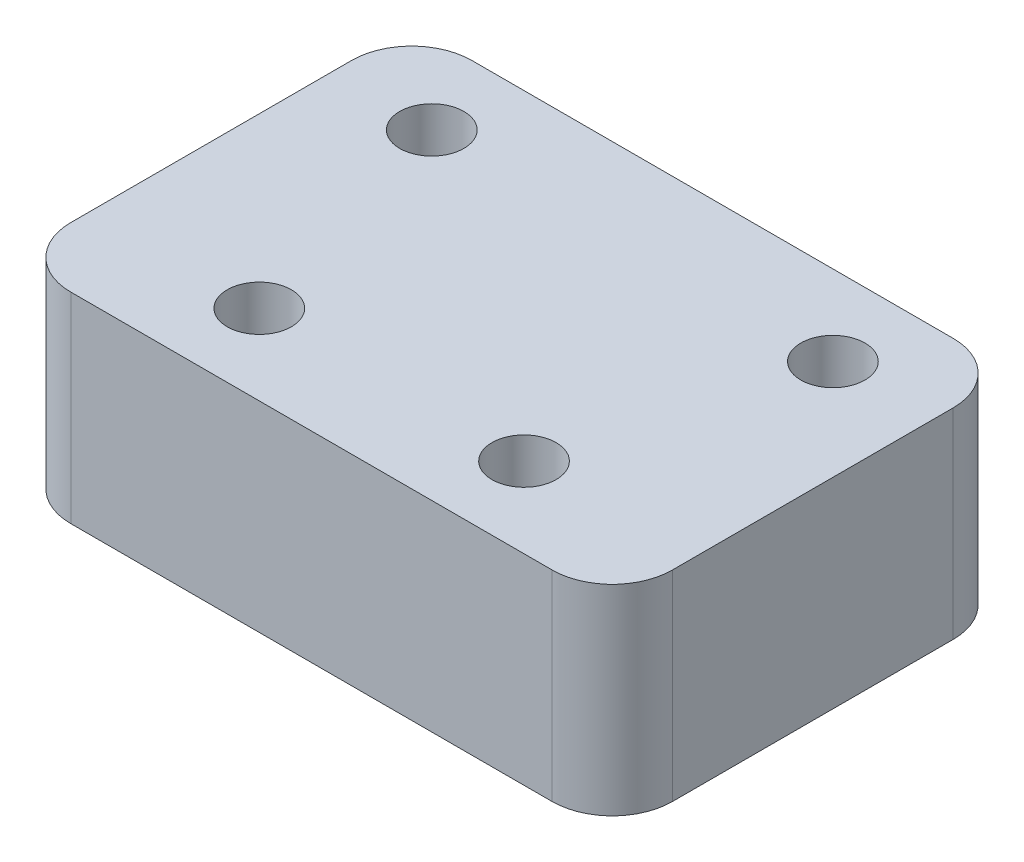
ISO-10303-21;
HEADER;
FILE_DESCRIPTION(('STEP AP214'),'2;1');
FILE_NAME('part.step','',(''),(''),'','','');
FILE_SCHEMA(('AUTOMOTIVE_DESIGN { 1 0 10303 214 1 1 1 1 }'));
ENDSEC;
DATA;
#1=APPLICATION_CONTEXT('core data for automotive mechanical design processes');
#2=APPLICATION_PROTOCOL_DEFINITION('international standard','automotive_design',2000,#1);
#3=PRODUCT_CONTEXT('',#1,'mechanical');
#4=PRODUCT('Part','Part','',(#3));
#5=PRODUCT_RELATED_PRODUCT_CATEGORY('part','',(#4));
#6=PRODUCT_DEFINITION_FORMATION('','',#4);
#7=PRODUCT_DEFINITION_CONTEXT('part definition',#1,'design');
#8=PRODUCT_DEFINITION('design','',#6,#7);
#9=PRODUCT_DEFINITION_SHAPE('','',#8);
#10=(LENGTH_UNIT() NAMED_UNIT(*) SI_UNIT(.MILLI.,.METRE.));
#11=(NAMED_UNIT(*) PLANE_ANGLE_UNIT() SI_UNIT($,.RADIAN.));
#12=(NAMED_UNIT(*) SI_UNIT($,.STERADIAN.) SOLID_ANGLE_UNIT());
#13=UNCERTAINTY_MEASURE_WITH_UNIT(LENGTH_MEASURE(1.E-05),#10,'distance_accuracy_value','');
#14=(GEOMETRIC_REPRESENTATION_CONTEXT(3) GLOBAL_UNCERTAINTY_ASSIGNED_CONTEXT((#13)) GLOBAL_UNIT_ASSIGNED_CONTEXT((#10,
#11,#12)) REPRESENTATION_CONTEXT('',''));
#15=CARTESIAN_POINT('',(0.,0.,0.));
#16=DIRECTION('',(0.,0.,1.));
#17=DIRECTION('',(1.,0.,0.));
#18=AXIS2_PLACEMENT_3D('',#15,#16,#17);
#19=CARTESIAN_POINT('',(0.,10.,0.));
#20=DIRECTION('',(0.,-1.,0.));
#21=DIRECTION('',(0.,0.,-1.));
#22=AXIS2_PLACEMENT_3D('',#19,#20,#21);
#23=PLANE('',#22);
#24=DIRECTION('',(0.,0.,-1.));
#25=VECTOR('',#24,1.);
#26=CARTESIAN_POINT('',(30.,10.,0.));
#27=LINE('',#26,#25);
#28=CARTESIAN_POINT('',(30.,10.,-3.));
#29=VERTEX_POINT('',#28);
#30=CARTESIAN_POINT('',(30.,10.,-17.));
#31=VERTEX_POINT('',#30);
#32=EDGE_CURVE('E206',#29,#31,#27,.T.);
#33=ORIENTED_EDGE('',*,*,#32,.T.);
#34=CARTESIAN_POINT('',(27.,10.,-17.));
#35=DIRECTION('',(0.,-1.,0.));
#36=DIRECTION('',(0.,0.,-1.));
#37=AXIS2_PLACEMENT_3D('',#34,#35,#36);
#38=CIRCLE('',#37,3.);
#39=CARTESIAN_POINT('',(27.,10.,-20.));
#40=VERTEX_POINT('',#39);
#41=EDGE_CURVE('E175',#31,#40,#38,.F.);
#42=ORIENTED_EDGE('',*,*,#41,.T.);
#43=DIRECTION('',(-1.,0.,0.));
#44=VECTOR('',#43,1.);
#45=CARTESIAN_POINT('',(0.,10.,-20.));
#46=LINE('',#45,#44);
#47=CARTESIAN_POINT('',(3.,10.,-20.));
#48=VERTEX_POINT('',#47);
#49=EDGE_CURVE('E133',#40,#48,#46,.T.);
#50=ORIENTED_EDGE('',*,*,#49,.T.);
#51=CARTESIAN_POINT('',(3.,10.,-17.));
#52=DIRECTION('',(0.,-1.,0.));
#53=DIRECTION('',(0.,0.,-1.));
#54=AXIS2_PLACEMENT_3D('',#51,#52,#53);
#55=CIRCLE('',#54,3.);
#56=CARTESIAN_POINT('',(0.,10.,-17.));
#57=VERTEX_POINT('',#56);
#58=EDGE_CURVE('E167',#48,#57,#55,.F.);
#59=ORIENTED_EDGE('',*,*,#58,.T.);
#60=DIRECTION('',(0.,0.,1.));
#61=VECTOR('',#60,1.);
#62=CARTESIAN_POINT('',(0.,10.,0.));
#63=LINE('',#62,#61);
#64=CARTESIAN_POINT('',(0.,10.,-3.));
#65=VERTEX_POINT('',#64);
#66=EDGE_CURVE('E142',#57,#65,#63,.T.);
#67=ORIENTED_EDGE('',*,*,#66,.T.);
#68=CARTESIAN_POINT('',(3.,10.,-3.));
#69=DIRECTION('',(0.,-1.,0.));
#70=DIRECTION('',(0.,0.,-1.));
#71=AXIS2_PLACEMENT_3D('',#68,#69,#70);
#72=CIRCLE('',#71,3.);
#73=CARTESIAN_POINT('',(3.,10.,0.));
#74=VERTEX_POINT('',#73);
#75=EDGE_CURVE('E68',#65,#74,#72,.F.);
#76=ORIENTED_EDGE('',*,*,#75,.T.);
#77=DIRECTION('',(1.,0.,0.));
#78=VECTOR('',#77,1.);
#79=CARTESIAN_POINT('',(0.,10.,0.));
#80=LINE('',#79,#78);
#81=CARTESIAN_POINT('',(27.,10.,0.));
#82=VERTEX_POINT('',#81);
#83=EDGE_CURVE('E147',#74,#82,#80,.T.);
#84=ORIENTED_EDGE('',*,*,#83,.T.);
#85=CARTESIAN_POINT('',(27.,10.,-3.));
#86=DIRECTION('',(0.,-1.,0.));
#87=DIRECTION('',(0.,0.,-1.));
#88=AXIS2_PLACEMENT_3D('',#85,#86,#87);
#89=CIRCLE('',#88,3.);
#90=EDGE_CURVE('E172',#82,#29,#89,.F.);
#91=ORIENTED_EDGE('',*,*,#90,.T.);
#92=EDGE_LOOP('',(#33,#42,#50,#59,#67,#76,#84,#91));
#93=FACE_BOUND('',#92,.T.);
#94=CARTESIAN_POINT('',(5.,10.,-16.));
#95=DIRECTION('',(0.,1.,0.));
#96=DIRECTION('',(0.,0.,1.));
#97=AXIS2_PLACEMENT_3D('',#94,#95,#96);
#98=CIRCLE('',#97,1.6);
#99=CARTESIAN_POINT('',(5.,10.,-14.4));
#100=VERTEX_POINT('',#99);
#101=EDGE_CURVE('E196',#100,#100,#98,.T.);
#102=ORIENTED_EDGE('',*,*,#101,.F.);
#103=EDGE_LOOP('',(#102));
#104=FACE_BOUND('',#103,.T.);
#105=CARTESIAN_POINT('',(25.,10.,-16.));
#106=DIRECTION('',(0.,1.,0.));
#107=DIRECTION('',(0.,0.,1.));
#108=AXIS2_PLACEMENT_3D('',#105,#106,#107);
#109=CIRCLE('',#108,1.6);
#110=CARTESIAN_POINT('',(25.,10.,-14.4));
#111=VERTEX_POINT('',#110);
#112=EDGE_CURVE('E214',#111,#111,#109,.T.);
#113=ORIENTED_EDGE('',*,*,#112,.F.);
#114=EDGE_LOOP('',(#113));
#115=FACE_BOUND('',#114,.T.);
#116=CARTESIAN_POINT('',(8.4,10.,-4.));
#117=DIRECTION('',(0.,1.,0.));
#118=DIRECTION('',(0.,0.,1.));
#119=AXIS2_PLACEMENT_3D('',#116,#117,#118);
#120=CIRCLE('',#119,1.6);
#121=CARTESIAN_POINT('',(8.4,10.,-2.4));
#122=VERTEX_POINT('',#121);
#123=EDGE_CURVE('E220',#122,#122,#120,.T.);
#124=ORIENTED_EDGE('',*,*,#123,.F.);
#125=EDGE_LOOP('',(#124));
#126=FACE_BOUND('',#125,.T.);
#127=CARTESIAN_POINT('',(21.6,10.,-4.));
#128=DIRECTION('',(0.,1.,0.));
#129=DIRECTION('',(0.,0.,1.));
#130=AXIS2_PLACEMENT_3D('',#127,#128,#129);
#131=CIRCLE('',#130,1.6);
#132=CARTESIAN_POINT('',(21.6,10.,-2.4));
#133=VERTEX_POINT('',#132);
#134=EDGE_CURVE('E228',#133,#133,#131,.T.);
#135=ORIENTED_EDGE('',*,*,#134,.F.);
#136=EDGE_LOOP('',(#135));
#137=FACE_BOUND('',#136,.T.);
#138=ADVANCED_FACE('F45',(#93,#104,#115,#126,#137),#23,.F.);
#139=CARTESIAN_POINT('',(0.,0.,0.));
#140=DIRECTION('',(0.,-1.,0.));
#141=DIRECTION('',(0.,0.,-1.));
#142=AXIS2_PLACEMENT_3D('',#139,#140,#141);
#143=PLANE('',#142);
#144=CARTESIAN_POINT('',(8.4,0.,-4.));
#145=DIRECTION('',(0.,1.,0.));
#146=DIRECTION('',(0.,0.,1.));
#147=AXIS2_PLACEMENT_3D('',#144,#145,#146);
#148=CIRCLE('',#147,1.6);
#149=CARTESIAN_POINT('',(8.4,0.,-2.4));
#150=VERTEX_POINT('',#149);
#151=EDGE_CURVE('E224',#150,#150,#148,.T.);
#152=ORIENTED_EDGE('',*,*,#151,.T.);
#153=EDGE_LOOP('',(#152));
#154=FACE_BOUND('',#153,.T.);
#155=CARTESIAN_POINT('',(5.,0.,-16.));
#156=DIRECTION('',(0.,1.,0.));
#157=DIRECTION('',(0.,0.,1.));
#158=AXIS2_PLACEMENT_3D('',#155,#156,#157);
#159=CIRCLE('',#158,1.6);
#160=CARTESIAN_POINT('',(5.,0.,-14.4));
#161=VERTEX_POINT('',#160);
#162=EDGE_CURVE('E201',#161,#161,#159,.T.);
#163=ORIENTED_EDGE('',*,*,#162,.T.);
#164=EDGE_LOOP('',(#163));
#165=FACE_BOUND('',#164,.T.);
#166=DIRECTION('',(-1.,0.,0.));
#167=VECTOR('',#166,1.);
#168=CARTESIAN_POINT('',(0.,0.,-20.));
#169=LINE('',#168,#167);
#170=CARTESIAN_POINT('',(27.,0.,-20.));
#171=VERTEX_POINT('',#170);
#172=CARTESIAN_POINT('',(3.,0.,-20.));
#173=VERTEX_POINT('',#172);
#174=EDGE_CURVE('E130',#171,#173,#169,.T.);
#175=ORIENTED_EDGE('',*,*,#174,.F.);
#176=CARTESIAN_POINT('',(27.,0.,-17.));
#177=DIRECTION('',(0.,-1.,0.));
#178=DIRECTION('',(0.,0.,-1.));
#179=AXIS2_PLACEMENT_3D('',#176,#177,#178);
#180=CIRCLE('',#179,3.);
#181=CARTESIAN_POINT('',(30.,0.,-17.));
#182=VERTEX_POINT('',#181);
#183=EDGE_CURVE('E112',#171,#182,#180,.T.);
#184=ORIENTED_EDGE('',*,*,#183,.T.);
#185=DIRECTION('',(0.,0.,-1.));
#186=VECTOR('',#185,1.);
#187=CARTESIAN_POINT('',(30.,0.,0.));
#188=LINE('',#187,#186);
#189=CARTESIAN_POINT('',(30.,0.,-3.));
#190=VERTEX_POINT('',#189);
#191=EDGE_CURVE('E143',#190,#182,#188,.T.);
#192=ORIENTED_EDGE('',*,*,#191,.F.);
#193=CARTESIAN_POINT('',(27.,0.,-3.));
#194=DIRECTION('',(0.,-1.,0.));
#195=DIRECTION('',(0.,0.,-1.));
#196=AXIS2_PLACEMENT_3D('',#193,#194,#195);
#197=CIRCLE('',#196,3.);
#198=CARTESIAN_POINT('',(27.,0.,0.));
#199=VERTEX_POINT('',#198);
#200=EDGE_CURVE('E124',#190,#199,#197,.T.);
#201=ORIENTED_EDGE('',*,*,#200,.T.);
#202=DIRECTION('',(1.,0.,0.));
#203=VECTOR('',#202,1.);
#204=CARTESIAN_POINT('',(0.,0.,0.));
#205=LINE('',#204,#203);
#206=CARTESIAN_POINT('',(3.,0.,0.));
#207=VERTEX_POINT('',#206);
#208=EDGE_CURVE('E149',#207,#199,#205,.T.);
#209=ORIENTED_EDGE('',*,*,#208,.F.);
#210=CARTESIAN_POINT('',(3.,0.,-3.));
#211=DIRECTION('',(0.,-1.,0.));
#212=DIRECTION('',(0.,0.,-1.));
#213=AXIS2_PLACEMENT_3D('',#210,#211,#212);
#214=CIRCLE('',#213,3.);
#215=CARTESIAN_POINT('',(0.,0.,-3.));
#216=VERTEX_POINT('',#215);
#217=EDGE_CURVE('E157',#207,#216,#214,.T.);
#218=ORIENTED_EDGE('',*,*,#217,.T.);
#219=DIRECTION('',(0.,0.,1.));
#220=VECTOR('',#219,1.);
#221=CARTESIAN_POINT('',(0.,0.,0.));
#222=LINE('',#221,#220);
#223=CARTESIAN_POINT('',(0.,0.,-17.));
#224=VERTEX_POINT('',#223);
#225=EDGE_CURVE('E190',#224,#216,#222,.T.);
#226=ORIENTED_EDGE('',*,*,#225,.F.);
#227=CARTESIAN_POINT('',(3.,0.,-17.));
#228=DIRECTION('',(0.,-1.,0.));
#229=DIRECTION('',(0.,0.,-1.));
#230=AXIS2_PLACEMENT_3D('',#227,#228,#229);
#231=CIRCLE('',#230,3.);
#232=EDGE_CURVE('E135',#224,#173,#231,.T.);
#233=ORIENTED_EDGE('',*,*,#232,.T.);
#234=EDGE_LOOP('',(#175,#184,#192,#201,#209,#218,#226,#233));
#235=FACE_BOUND('',#234,.T.);
#236=CARTESIAN_POINT('',(25.,0.,-16.));
#237=DIRECTION('',(0.,1.,0.));
#238=DIRECTION('',(0.,0.,1.));
#239=AXIS2_PLACEMENT_3D('',#236,#237,#238);
#240=CIRCLE('',#239,1.6);
#241=CARTESIAN_POINT('',(25.,0.,-14.4));
#242=VERTEX_POINT('',#241);
#243=EDGE_CURVE('E216',#242,#242,#240,.T.);
#244=ORIENTED_EDGE('',*,*,#243,.T.);
#245=EDGE_LOOP('',(#244));
#246=FACE_BOUND('',#245,.T.);
#247=CARTESIAN_POINT('',(21.6,0.,-4.));
#248=DIRECTION('',(0.,1.,0.));
#249=DIRECTION('',(0.,0.,1.));
#250=AXIS2_PLACEMENT_3D('',#247,#248,#249);
#251=CIRCLE('',#250,1.6);
#252=CARTESIAN_POINT('',(21.6,0.,-2.4));
#253=VERTEX_POINT('',#252);
#254=EDGE_CURVE('E232',#253,#253,#251,.T.);
#255=ORIENTED_EDGE('',*,*,#254,.T.);
#256=EDGE_LOOP('',(#255));
#257=FACE_BOUND('',#256,.T.);
#258=ADVANCED_FACE('F138',(#154,#165,#235,#246,#257),#143,.T.);
#259=CARTESIAN_POINT('',(0.,10.,0.));
#260=DIRECTION('',(1.,0.,0.));
#261=DIRECTION('',(0.,0.,-1.));
#262=AXIS2_PLACEMENT_3D('',#259,#260,#261);
#263=PLANE('',#262);
#264=ORIENTED_EDGE('',*,*,#225,.T.);
#265=DIRECTION('',(0.,-1.,0.));
#266=VECTOR('',#265,1.);
#267=CARTESIAN_POINT('',(0.,10.,-3.));
#268=LINE('',#267,#266);
#269=EDGE_CURVE('E11',#216,#65,#268,.F.);
#270=ORIENTED_EDGE('',*,*,#269,.T.);
#271=ORIENTED_EDGE('',*,*,#66,.F.);
#272=DIRECTION('',(0.,-1.,0.));
#273=VECTOR('',#272,1.);
#274=CARTESIAN_POINT('',(0.,10.,-17.));
#275=LINE('',#274,#273);
#276=EDGE_CURVE('E54',#57,#224,#275,.T.);
#277=ORIENTED_EDGE('',*,*,#276,.T.);
#278=EDGE_LOOP('',(#264,#270,#271,#277));
#279=FACE_BOUND('',#278,.T.);
#280=ADVANCED_FACE('F189',(#279),#263,.F.);
#281=CARTESIAN_POINT('',(0.,10.,0.));
#282=DIRECTION('',(0.,0.,-1.));
#283=DIRECTION('',(-1.,0.,0.));
#284=AXIS2_PLACEMENT_3D('',#281,#282,#283);
#285=PLANE('',#284);
#286=ORIENTED_EDGE('',*,*,#208,.T.);
#287=DIRECTION('',(0.,-1.,0.));
#288=VECTOR('',#287,1.);
#289=CARTESIAN_POINT('',(27.,10.,0.));
#290=LINE('',#289,#288);
#291=EDGE_CURVE('E61',#199,#82,#290,.F.);
#292=ORIENTED_EDGE('',*,*,#291,.T.);
#293=ORIENTED_EDGE('',*,*,#83,.F.);
#294=DIRECTION('',(0.,-1.,0.));
#295=VECTOR('',#294,1.);
#296=CARTESIAN_POINT('',(3.,10.,0.));
#297=LINE('',#296,#295);
#298=EDGE_CURVE('E178',#74,#207,#297,.T.);
#299=ORIENTED_EDGE('',*,*,#298,.T.);
#300=EDGE_LOOP('',(#286,#292,#293,#299));
#301=FACE_BOUND('',#300,.T.);
#302=ADVANCED_FACE('F261',(#301),#285,.F.);
#303=CARTESIAN_POINT('',(30.,10.,0.));
#304=DIRECTION('',(-1.,0.,0.));
#305=DIRECTION('',(0.,0.,1.));
#306=AXIS2_PLACEMENT_3D('',#303,#304,#305);
#307=PLANE('',#306);
#308=ORIENTED_EDGE('',*,*,#191,.T.);
#309=DIRECTION('',(0.,-1.,0.));
#310=VECTOR('',#309,1.);
#311=CARTESIAN_POINT('',(30.,10.,-17.));
#312=LINE('',#311,#310);
#313=EDGE_CURVE('E117',#182,#31,#312,.F.);
#314=ORIENTED_EDGE('',*,*,#313,.T.);
#315=ORIENTED_EDGE('',*,*,#32,.F.);
#316=DIRECTION('',(0.,-1.,0.));
#317=VECTOR('',#316,1.);
#318=CARTESIAN_POINT('',(30.,10.,-3.));
#319=LINE('',#318,#317);
#320=EDGE_CURVE('E123',#29,#190,#319,.T.);
#321=ORIENTED_EDGE('',*,*,#320,.T.);
#322=EDGE_LOOP('',(#308,#314,#315,#321));
#323=FACE_BOUND('',#322,.T.);
#324=ADVANCED_FACE('F258',(#323),#307,.F.);
#325=CARTESIAN_POINT('',(0.,10.,-20.));
#326=DIRECTION('',(0.,0.,1.));
#327=DIRECTION('',(1.,0.,0.));
#328=AXIS2_PLACEMENT_3D('',#325,#326,#327);
#329=PLANE('',#328);
#330=ORIENTED_EDGE('',*,*,#49,.F.);
#331=DIRECTION('',(0.,-1.,0.));
#332=VECTOR('',#331,1.);
#333=CARTESIAN_POINT('',(27.,10.,-20.));
#334=LINE('',#333,#332);
#335=EDGE_CURVE('E116',#40,#171,#334,.T.);
#336=ORIENTED_EDGE('',*,*,#335,.T.);
#337=ORIENTED_EDGE('',*,*,#174,.T.);
#338=DIRECTION('',(0.,-1.,0.));
#339=VECTOR('',#338,1.);
#340=CARTESIAN_POINT('',(3.,10.,-20.));
#341=LINE('',#340,#339);
#342=EDGE_CURVE('E136',#173,#48,#341,.F.);
#343=ORIENTED_EDGE('',*,*,#342,.T.);
#344=EDGE_LOOP('',(#330,#336,#337,#343));
#345=FACE_BOUND('',#344,.T.);
#346=ADVANCED_FACE('F129',(#345),#329,.F.);
#347=CARTESIAN_POINT('',(5.,10.,-16.));
#348=DIRECTION('',(0.,-1.,0.));
#349=DIRECTION('',(0.,0.,-1.));
#350=AXIS2_PLACEMENT_3D('',#347,#348,#349);
#351=CYLINDRICAL_SURFACE('',#350,1.6);
#352=ORIENTED_EDGE('',*,*,#101,.T.);
#353=EDGE_LOOP('',(#352));
#354=FACE_BOUND('',#353,.T.);
#355=ORIENTED_EDGE('',*,*,#162,.F.);
#356=EDGE_LOOP('',(#355));
#357=FACE_BOUND('',#356,.T.);
#358=ADVANCED_FACE('F253',(#354,#357),#351,.F.);
#359=CARTESIAN_POINT('',(25.,10.,-16.));
#360=DIRECTION('',(0.,-1.,0.));
#361=DIRECTION('',(0.,0.,-1.));
#362=AXIS2_PLACEMENT_3D('',#359,#360,#361);
#363=CYLINDRICAL_SURFACE('',#362,1.6);
#364=ORIENTED_EDGE('',*,*,#112,.T.);
#365=EDGE_LOOP('',(#364));
#366=FACE_BOUND('',#365,.T.);
#367=ORIENTED_EDGE('',*,*,#243,.F.);
#368=EDGE_LOOP('',(#367));
#369=FACE_BOUND('',#368,.T.);
#370=ADVANCED_FACE('F318',(#366,#369),#363,.F.);
#371=CARTESIAN_POINT('',(8.4,10.,-4.));
#372=DIRECTION('',(0.,-1.,0.));
#373=DIRECTION('',(0.,0.,-1.));
#374=AXIS2_PLACEMENT_3D('',#371,#372,#373);
#375=CYLINDRICAL_SURFACE('',#374,1.6);
#376=ORIENTED_EDGE('',*,*,#123,.T.);
#377=EDGE_LOOP('',(#376));
#378=FACE_BOUND('',#377,.T.);
#379=ORIENTED_EDGE('',*,*,#151,.F.);
#380=EDGE_LOOP('',(#379));
#381=FACE_BOUND('',#380,.T.);
#382=ADVANCED_FACE('F309',(#378,#381),#375,.F.);
#383=CARTESIAN_POINT('',(21.6,10.,-4.));
#384=DIRECTION('',(0.,-1.,0.));
#385=DIRECTION('',(0.,0.,-1.));
#386=AXIS2_PLACEMENT_3D('',#383,#384,#385);
#387=CYLINDRICAL_SURFACE('',#386,1.6);
#388=ORIENTED_EDGE('',*,*,#134,.T.);
#389=EDGE_LOOP('',(#388));
#390=FACE_BOUND('',#389,.T.);
#391=ORIENTED_EDGE('',*,*,#254,.F.);
#392=EDGE_LOOP('',(#391));
#393=FACE_BOUND('',#392,.T.);
#394=ADVANCED_FACE('F240',(#390,#393),#387,.F.);
#395=CARTESIAN_POINT('',(27.,10.,-17.));
#396=DIRECTION('',(0.,-1.,0.));
#397=DIRECTION('',(0.,0.,-1.));
#398=AXIS2_PLACEMENT_3D('',#395,#396,#397);
#399=CYLINDRICAL_SURFACE('',#398,3.);
#400=ORIENTED_EDGE('',*,*,#41,.F.);
#401=ORIENTED_EDGE('',*,*,#313,.F.);
#402=ORIENTED_EDGE('',*,*,#183,.F.);
#403=ORIENTED_EDGE('',*,*,#335,.F.);
#404=EDGE_LOOP('',(#400,#401,#402,#403));
#405=FACE_BOUND('',#404,.T.);
#406=ADVANCED_FACE('F115',(#405),#399,.T.);
#407=CARTESIAN_POINT('',(27.,10.,-3.));
#408=DIRECTION('',(0.,-1.,0.));
#409=DIRECTION('',(0.,0.,-1.));
#410=AXIS2_PLACEMENT_3D('',#407,#408,#409);
#411=CYLINDRICAL_SURFACE('',#410,3.);
#412=ORIENTED_EDGE('',*,*,#90,.F.);
#413=ORIENTED_EDGE('',*,*,#291,.F.);
#414=ORIENTED_EDGE('',*,*,#200,.F.);
#415=ORIENTED_EDGE('',*,*,#320,.F.);
#416=EDGE_LOOP('',(#412,#413,#414,#415));
#417=FACE_BOUND('',#416,.T.);
#418=ADVANCED_FACE('F269',(#417),#411,.T.);
#419=CARTESIAN_POINT('',(3.,10.,-3.));
#420=DIRECTION('',(0.,-1.,0.));
#421=DIRECTION('',(0.,0.,-1.));
#422=AXIS2_PLACEMENT_3D('',#419,#420,#421);
#423=CYLINDRICAL_SURFACE('',#422,3.);
#424=ORIENTED_EDGE('',*,*,#75,.F.);
#425=ORIENTED_EDGE('',*,*,#269,.F.);
#426=ORIENTED_EDGE('',*,*,#217,.F.);
#427=ORIENTED_EDGE('',*,*,#298,.F.);
#428=EDGE_LOOP('',(#424,#425,#426,#427));
#429=FACE_BOUND('',#428,.T.);
#430=ADVANCED_FACE('F271',(#429),#423,.T.);
#431=CARTESIAN_POINT('',(3.,10.,-17.));
#432=DIRECTION('',(0.,-1.,0.));
#433=DIRECTION('',(0.,0.,-1.));
#434=AXIS2_PLACEMENT_3D('',#431,#432,#433);
#435=CYLINDRICAL_SURFACE('',#434,3.);
#436=ORIENTED_EDGE('',*,*,#58,.F.);
#437=ORIENTED_EDGE('',*,*,#342,.F.);
#438=ORIENTED_EDGE('',*,*,#232,.F.);
#439=ORIENTED_EDGE('',*,*,#276,.F.);
#440=EDGE_LOOP('',(#436,#437,#438,#439));
#441=FACE_BOUND('',#440,.T.);
#442=ADVANCED_FACE('F47',(#441),#435,.T.);
#443=CLOSED_SHELL('',(#138,#258,#280,#302,#324,#346,#358,#370,#382,#394,#406,#418,#430,#442));
#444=MANIFOLD_SOLID_BREP('B2',#443);
#445=ADVANCED_BREP_SHAPE_REPRESENTATION('',(#18,#444),#14);
#446=SHAPE_DEFINITION_REPRESENTATION(#9,#445);
ENDSEC;
END-ISO-10303-21;
